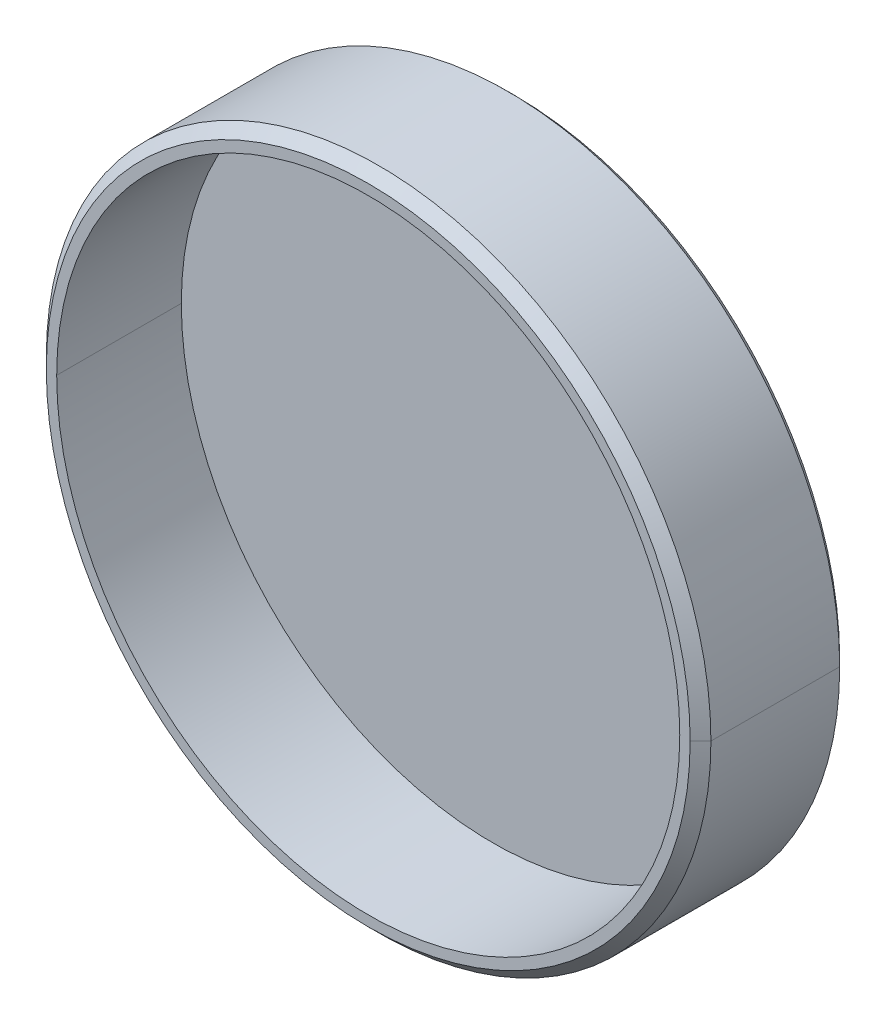
ISO-10303-21;
HEADER;
FILE_DESCRIPTION(('STEP AP214'),'2;1');
FILE_NAME('part.step','',(''),(''),'','','');
FILE_SCHEMA(('AUTOMOTIVE_DESIGN { 1 0 10303 214 1 1 1 1 }'));
ENDSEC;
DATA;
#1=APPLICATION_CONTEXT('core data for automotive mechanical design processes');
#2=APPLICATION_PROTOCOL_DEFINITION('international standard','automotive_design',2000,#1);
#3=PRODUCT_CONTEXT('',#1,'mechanical');
#4=PRODUCT('Part','Part','',(#3));
#5=PRODUCT_RELATED_PRODUCT_CATEGORY('part','',(#4));
#6=PRODUCT_DEFINITION_FORMATION('','',#4);
#7=PRODUCT_DEFINITION_CONTEXT('part definition',#1,'design');
#8=PRODUCT_DEFINITION('design','',#6,#7);
#9=PRODUCT_DEFINITION_SHAPE('','',#8);
#10=(LENGTH_UNIT() NAMED_UNIT(*) SI_UNIT(.MILLI.,.METRE.));
#11=(NAMED_UNIT(*) PLANE_ANGLE_UNIT() SI_UNIT($,.RADIAN.));
#12=(NAMED_UNIT(*) SI_UNIT($,.STERADIAN.) SOLID_ANGLE_UNIT());
#13=UNCERTAINTY_MEASURE_WITH_UNIT(LENGTH_MEASURE(1.E-05),#10,'distance_accuracy_value','');
#14=(GEOMETRIC_REPRESENTATION_CONTEXT(3) GLOBAL_UNCERTAINTY_ASSIGNED_CONTEXT((#13)) GLOBAL_UNIT_ASSIGNED_CONTEXT((#10,
#11,#12)) REPRESENTATION_CONTEXT('',''));
#15=CARTESIAN_POINT('',(0.,0.,0.));
#16=DIRECTION('',(0.,0.,1.));
#17=DIRECTION('',(1.,0.,0.));
#18=AXIS2_PLACEMENT_3D('',#15,#16,#17);
#19=CARTESIAN_POINT('',(0.,0.,0.300000000000005));
#20=DIRECTION('',(0.,0.,1.));
#21=DIRECTION('',(1.,0.,0.));
#22=AXIS2_PLACEMENT_3D('',#19,#20,#21);
#23=CONICAL_SURFACE('',#22,16.,0.785398163397454);
#24=DIRECTION('',(-0.707106781186552,0.,0.707106781186544));
#25=VECTOR('',#24,1.);
#26=CARTESIAN_POINT('',(-16.,0.,0.300000000000005));
#27=LINE('',#26,#25);
#28=CARTESIAN_POINT('',(-15.7,0.,0.));
#29=VERTEX_POINT('',#28);
#30=CARTESIAN_POINT('',(-16.,0.,0.300000000000005));
#31=VERTEX_POINT('',#30);
#32=EDGE_CURVE('E104',#29,#31,#27,.T.);
#33=ORIENTED_EDGE('',*,*,#32,.F.);
#34=CARTESIAN_POINT('',(0.,0.,0.));
#35=DIRECTION('',(0.,0.,-1.));
#36=DIRECTION('',(1.,0.,0.));
#37=AXIS2_PLACEMENT_3D('',#34,#35,#36);
#38=CIRCLE('',#37,15.7);
#39=CARTESIAN_POINT('',(15.7,0.,0.));
#40=VERTEX_POINT('',#39);
#41=EDGE_CURVE('E90',#40,#29,#38,.T.);
#42=ORIENTED_EDGE('',*,*,#41,.F.);
#43=DIRECTION('',(0.707106781186552,0.,0.707106781186544));
#44=VECTOR('',#43,1.);
#45=CARTESIAN_POINT('',(16.,0.,0.300000000000005));
#46=LINE('',#45,#44);
#47=CARTESIAN_POINT('',(16.,0.,0.300000000000005));
#48=VERTEX_POINT('',#47);
#49=EDGE_CURVE('E113',#40,#48,#46,.T.);
#50=ORIENTED_EDGE('',*,*,#49,.T.);
#51=CARTESIAN_POINT('',(0.,0.,0.300000000000005));
#52=DIRECTION('',(0.,0.,1.));
#53=DIRECTION('',(1.,0.,0.));
#54=AXIS2_PLACEMENT_3D('',#51,#52,#53);
#55=CIRCLE('',#54,16.);
#56=EDGE_CURVE('E105',#31,#48,#55,.T.);
#57=ORIENTED_EDGE('',*,*,#56,.F.);
#58=EDGE_LOOP('',(#33,#42,#50,#57));
#59=FACE_BOUND('',#58,.T.);
#60=ADVANCED_FACE('F18',(#59),#23,.T.);
#61=CARTESIAN_POINT('',(0.,0.,7.));
#62=DIRECTION('',(0.,0.,-1.));
#63=DIRECTION('',(-1.,0.,0.));
#64=AXIS2_PLACEMENT_3D('',#61,#62,#63);
#65=CONICAL_SURFACE('',#64,15.5,0.785398163397442);
#66=DIRECTION('',(0.707106781186543,0.,-0.707106781186553));
#67=VECTOR('',#66,1.);
#68=CARTESIAN_POINT('',(15.5,0.,7.));
#69=LINE('',#68,#67);
#70=CARTESIAN_POINT('',(15.5,0.,7.));
#71=VERTEX_POINT('',#70);
#72=CARTESIAN_POINT('',(16.,0.,6.5));
#73=VERTEX_POINT('',#72);
#74=EDGE_CURVE('E174',#71,#73,#69,.T.);
#75=ORIENTED_EDGE('',*,*,#74,.F.);
#76=CARTESIAN_POINT('',(0.,0.,7.));
#77=DIRECTION('',(0.,0.,1.));
#78=DIRECTION('',(1.,0.,0.));
#79=AXIS2_PLACEMENT_3D('',#76,#77,#78);
#80=CIRCLE('',#79,15.5);
#81=CARTESIAN_POINT('',(-15.5,0.,7.));
#82=VERTEX_POINT('',#81);
#83=EDGE_CURVE('E124',#82,#71,#80,.T.);
#84=ORIENTED_EDGE('',*,*,#83,.F.);
#85=DIRECTION('',(-0.707106781186543,0.,-0.707106781186553));
#86=VECTOR('',#85,1.);
#87=CARTESIAN_POINT('',(-15.5,0.,7.));
#88=LINE('',#87,#86);
#89=CARTESIAN_POINT('',(-16.,0.,6.5));
#90=VERTEX_POINT('',#89);
#91=EDGE_CURVE('E144',#82,#90,#88,.T.);
#92=ORIENTED_EDGE('',*,*,#91,.T.);
#93=CARTESIAN_POINT('',(0.,0.,6.5));
#94=DIRECTION('',(0.,0.,-1.));
#95=DIRECTION('',(1.,0.,0.));
#96=AXIS2_PLACEMENT_3D('',#93,#94,#95);
#97=CIRCLE('',#96,16.);
#98=EDGE_CURVE('E125',#73,#90,#97,.T.);
#99=ORIENTED_EDGE('',*,*,#98,.F.);
#100=EDGE_LOOP('',(#75,#84,#92,#99));
#101=FACE_BOUND('',#100,.T.);
#102=ADVANCED_FACE('F241',(#101),#65,.T.);
#103=CARTESIAN_POINT('',(0.,0.,0.1));
#104=DIRECTION('',(0.,0.,-1.));
#105=DIRECTION('',(0.,-1.,0.));
#106=AXIS2_PLACEMENT_3D('',#103,#104,#105);
#107=PLANE('',#106);
#108=CARTESIAN_POINT('',(0.,0.,0.1));
#109=DIRECTION('',(0.,0.,-1.));
#110=DIRECTION('',(-1.,0.,0.));
#111=AXIS2_PLACEMENT_3D('',#108,#109,#110);
#112=CIRCLE('',#111,13.);
#113=CARTESIAN_POINT('',(-13.,0.,0.1));
#114=VERTEX_POINT('',#113);
#115=CARTESIAN_POINT('',(13.,0.,0.1));
#116=VERTEX_POINT('',#115);
#117=EDGE_CURVE('E11',#114,#116,#112,.T.);
#118=ORIENTED_EDGE('',*,*,#117,.T.);
#119=CARTESIAN_POINT('',(0.,0.,0.1));
#120=DIRECTION('',(0.,0.,-1.));
#121=DIRECTION('',(-1.,0.,0.));
#122=AXIS2_PLACEMENT_3D('',#119,#120,#121);
#123=CIRCLE('',#122,13.);
#124=EDGE_CURVE('E194',#116,#114,#123,.T.);
#125=ORIENTED_EDGE('',*,*,#124,.T.);
#126=EDGE_LOOP('',(#118,#125));
#127=FACE_BOUND('',#126,.T.);
#128=ADVANCED_FACE('F246',(#127),#107,.T.);
#129=CARTESIAN_POINT('',(0.,0.,0.1));
#130=DIRECTION('',(0.,0.,-1.));
#131=DIRECTION('',(-1.,0.,0.));
#132=AXIS2_PLACEMENT_3D('',#129,#130,#131);
#133=CYLINDRICAL_SURFACE('',#132,13.);
#134=DIRECTION('',(0.,0.,-1.));
#135=VECTOR('',#134,1.);
#136=CARTESIAN_POINT('',(13.,0.,0.1));
#137=LINE('',#136,#135);
#138=CARTESIAN_POINT('',(13.,0.,0.));
#139=VERTEX_POINT('',#138);
#140=EDGE_CURVE('E173',#116,#139,#137,.T.);
#141=ORIENTED_EDGE('',*,*,#140,.F.);
#142=ORIENTED_EDGE('',*,*,#117,.F.);
#143=DIRECTION('',(0.,0.,-1.));
#144=VECTOR('',#143,1.);
#145=CARTESIAN_POINT('',(-13.,0.,0.1));
#146=LINE('',#145,#144);
#147=CARTESIAN_POINT('',(-13.,0.,0.));
#148=VERTEX_POINT('',#147);
#149=EDGE_CURVE('E172',#114,#148,#146,.T.);
#150=ORIENTED_EDGE('',*,*,#149,.T.);
#151=CARTESIAN_POINT('',(0.,0.,0.));
#152=DIRECTION('',(0.,0.,-1.));
#153=DIRECTION('',(-1.,0.,0.));
#154=AXIS2_PLACEMENT_3D('',#151,#152,#153);
#155=CIRCLE('',#154,13.);
#156=EDGE_CURVE('E99',#148,#139,#155,.T.);
#157=ORIENTED_EDGE('',*,*,#156,.T.);
#158=EDGE_LOOP('',(#141,#142,#150,#157));
#159=FACE_BOUND('',#158,.T.);
#160=ADVANCED_FACE('F20',(#159),#133,.F.);
#161=CARTESIAN_POINT('',(0.,0.,1.));
#162=DIRECTION('',(0.,0.,1.));
#163=DIRECTION('',(1.,0.,0.));
#164=AXIS2_PLACEMENT_3D('',#161,#162,#163);
#165=PLANE('',#164);
#166=CARTESIAN_POINT('',(0.,0.,1.));
#167=DIRECTION('',(0.,0.,1.));
#168=DIRECTION('',(1.,0.,0.));
#169=AXIS2_PLACEMENT_3D('',#166,#167,#168);
#170=CIRCLE('',#169,15.);
#171=CARTESIAN_POINT('',(-15.,0.,1.));
#172=VERTEX_POINT('',#171);
#173=CARTESIAN_POINT('',(15.,0.,1.));
#174=VERTEX_POINT('',#173);
#175=EDGE_CURVE('E22',#172,#174,#170,.T.);
#176=ORIENTED_EDGE('',*,*,#175,.T.);
#177=CARTESIAN_POINT('',(0.,0.,1.));
#178=DIRECTION('',(0.,0.,1.));
#179=DIRECTION('',(1.,0.,0.));
#180=AXIS2_PLACEMENT_3D('',#177,#178,#179);
#181=CIRCLE('',#180,15.);
#182=EDGE_CURVE('E28',#174,#172,#181,.T.);
#183=ORIENTED_EDGE('',*,*,#182,.T.);
#184=EDGE_LOOP('',(#176,#183));
#185=FACE_BOUND('',#184,.T.);
#186=ADVANCED_FACE('F236',(#185),#165,.T.);
#187=CARTESIAN_POINT('',(0.,0.,7.));
#188=DIRECTION('',(0.,0.,-1.));
#189=DIRECTION('',(-1.,0.,0.));
#190=AXIS2_PLACEMENT_3D('',#187,#188,#189);
#191=CYLINDRICAL_SURFACE('',#190,15.);
#192=DIRECTION('',(0.,0.,-1.));
#193=VECTOR('',#192,1.);
#194=CARTESIAN_POINT('',(15.,0.,7.));
#195=LINE('',#194,#193);
#196=CARTESIAN_POINT('',(15.,0.,7.));
#197=VERTEX_POINT('',#196);
#198=EDGE_CURVE('E163',#197,#174,#195,.T.);
#199=ORIENTED_EDGE('',*,*,#198,.F.);
#200=CARTESIAN_POINT('',(0.,0.,7.));
#201=DIRECTION('',(0.,0.,1.));
#202=DIRECTION('',(1.,0.,0.));
#203=AXIS2_PLACEMENT_3D('',#200,#201,#202);
#204=CIRCLE('',#203,15.);
#205=CARTESIAN_POINT('',(-15.,0.,7.));
#206=VERTEX_POINT('',#205);
#207=EDGE_CURVE('E100',#197,#206,#204,.T.);
#208=ORIENTED_EDGE('',*,*,#207,.T.);
#209=DIRECTION('',(0.,0.,-1.));
#210=VECTOR('',#209,1.);
#211=CARTESIAN_POINT('',(-15.,0.,7.));
#212=LINE('',#211,#210);
#213=EDGE_CURVE('E153',#206,#172,#212,.T.);
#214=ORIENTED_EDGE('',*,*,#213,.T.);
#215=ORIENTED_EDGE('',*,*,#182,.F.);
#216=EDGE_LOOP('',(#199,#208,#214,#215));
#217=FACE_BOUND('',#216,.T.);
#218=ADVANCED_FACE('F226',(#217),#191,.F.);
#219=CARTESIAN_POINT('',(0.,0.,0.));
#220=DIRECTION('',(0.,0.,1.));
#221=DIRECTION('',(1.,0.,0.));
#222=AXIS2_PLACEMENT_3D('',#219,#220,#221);
#223=PLANE('',#222);
#224=ORIENTED_EDGE('',*,*,#156,.F.);
#225=CARTESIAN_POINT('',(0.,0.,0.));
#226=DIRECTION('',(0.,0.,-1.));
#227=DIRECTION('',(-1.,0.,0.));
#228=AXIS2_PLACEMENT_3D('',#225,#226,#227);
#229=CIRCLE('',#228,13.);
#230=EDGE_CURVE('E168',#139,#148,#229,.T.);
#231=ORIENTED_EDGE('',*,*,#230,.F.);
#232=EDGE_LOOP('',(#224,#231));
#233=FACE_BOUND('',#232,.T.);
#234=ORIENTED_EDGE('',*,*,#41,.T.);
#235=CARTESIAN_POINT('',(0.,0.,0.));
#236=DIRECTION('',(0.,0.,-1.));
#237=DIRECTION('',(1.,0.,0.));
#238=AXIS2_PLACEMENT_3D('',#235,#236,#237);
#239=CIRCLE('',#238,15.7);
#240=EDGE_CURVE('E94',#29,#40,#239,.T.);
#241=ORIENTED_EDGE('',*,*,#240,.T.);
#242=EDGE_LOOP('',(#234,#241));
#243=FACE_BOUND('',#242,.T.);
#244=ADVANCED_FACE('F92',(#233,#243),#223,.F.);
#245=CARTESIAN_POINT('',(0.,0.,7.));
#246=DIRECTION('',(0.,0.,1.));
#247=DIRECTION('',(1.,0.,0.));
#248=AXIS2_PLACEMENT_3D('',#245,#246,#247);
#249=PLANE('',#248);
#250=CARTESIAN_POINT('',(0.,0.,7.));
#251=DIRECTION('',(0.,0.,1.));
#252=DIRECTION('',(1.,0.,0.));
#253=AXIS2_PLACEMENT_3D('',#250,#251,#252);
#254=CIRCLE('',#253,15.);
#255=EDGE_CURVE('E167',#206,#197,#254,.T.);
#256=ORIENTED_EDGE('',*,*,#255,.F.);
#257=ORIENTED_EDGE('',*,*,#207,.F.);
#258=EDGE_LOOP('',(#256,#257));
#259=FACE_BOUND('',#258,.T.);
#260=ORIENTED_EDGE('',*,*,#83,.T.);
#261=CARTESIAN_POINT('',(0.,0.,7.));
#262=DIRECTION('',(0.,0.,1.));
#263=DIRECTION('',(1.,0.,0.));
#264=AXIS2_PLACEMENT_3D('',#261,#262,#263);
#265=CIRCLE('',#264,15.5);
#266=EDGE_CURVE('E147',#71,#82,#265,.T.);
#267=ORIENTED_EDGE('',*,*,#266,.T.);
#268=EDGE_LOOP('',(#260,#267));
#269=FACE_BOUND('',#268,.T.);
#270=ADVANCED_FACE('F185',(#259,#269),#249,.T.);
#271=CARTESIAN_POINT('',(0.,0.,7.));
#272=DIRECTION('',(0.,0.,-1.));
#273=DIRECTION('',(-1.,0.,0.));
#274=AXIS2_PLACEMENT_3D('',#271,#272,#273);
#275=CYLINDRICAL_SURFACE('',#274,16.);
#276=DIRECTION('',(0.,0.,-1.));
#277=VECTOR('',#276,1.);
#278=CARTESIAN_POINT('',(16.,0.,7.));
#279=LINE('',#278,#277);
#280=EDGE_CURVE('E148',#73,#48,#279,.T.);
#281=ORIENTED_EDGE('',*,*,#280,.F.);
#282=ORIENTED_EDGE('',*,*,#98,.T.);
#283=DIRECTION('',(0.,0.,-1.));
#284=VECTOR('',#283,1.);
#285=CARTESIAN_POINT('',(-16.,0.,7.));
#286=LINE('',#285,#284);
#287=EDGE_CURVE('E152',#90,#31,#286,.T.);
#288=ORIENTED_EDGE('',*,*,#287,.T.);
#289=ORIENTED_EDGE('',*,*,#56,.T.);
#290=EDGE_LOOP('',(#281,#282,#288,#289));
#291=FACE_BOUND('',#290,.T.);
#292=ADVANCED_FACE('F233',(#291),#275,.T.);
#293=CARTESIAN_POINT('',(0.,0.,7.));
#294=DIRECTION('',(0.,0.,-1.));
#295=DIRECTION('',(-1.,0.,0.));
#296=AXIS2_PLACEMENT_3D('',#293,#294,#295);
#297=CYLINDRICAL_SURFACE('',#296,16.);
#298=CARTESIAN_POINT('',(0.,0.,6.5));
#299=DIRECTION('',(0.,0.,-1.));
#300=DIRECTION('',(1.,0.,0.));
#301=AXIS2_PLACEMENT_3D('',#298,#299,#300);
#302=CIRCLE('',#301,16.);
#303=EDGE_CURVE('E178',#90,#73,#302,.T.);
#304=ORIENTED_EDGE('',*,*,#303,.T.);
#305=ORIENTED_EDGE('',*,*,#280,.T.);
#306=CARTESIAN_POINT('',(0.,0.,0.300000000000005));
#307=DIRECTION('',(0.,0.,1.));
#308=DIRECTION('',(1.,0.,0.));
#309=AXIS2_PLACEMENT_3D('',#306,#307,#308);
#310=CIRCLE('',#309,16.);
#311=EDGE_CURVE('E110',#48,#31,#310,.T.);
#312=ORIENTED_EDGE('',*,*,#311,.T.);
#313=ORIENTED_EDGE('',*,*,#287,.F.);
#314=EDGE_LOOP('',(#304,#305,#312,#313));
#315=FACE_BOUND('',#314,.T.);
#316=ADVANCED_FACE('F252',(#315),#297,.T.);
#317=CARTESIAN_POINT('',(0.,0.,7.));
#318=DIRECTION('',(0.,0.,-1.));
#319=DIRECTION('',(-1.,0.,0.));
#320=AXIS2_PLACEMENT_3D('',#317,#318,#319);
#321=CYLINDRICAL_SURFACE('',#320,15.);
#322=ORIENTED_EDGE('',*,*,#255,.T.);
#323=ORIENTED_EDGE('',*,*,#198,.T.);
#324=ORIENTED_EDGE('',*,*,#175,.F.);
#325=ORIENTED_EDGE('',*,*,#213,.F.);
#326=EDGE_LOOP('',(#322,#323,#324,#325));
#327=FACE_BOUND('',#326,.T.);
#328=ADVANCED_FACE('F249',(#327),#321,.F.);
#329=CARTESIAN_POINT('',(0.,0.,0.1));
#330=DIRECTION('',(0.,0.,-1.));
#331=DIRECTION('',(-1.,0.,0.));
#332=AXIS2_PLACEMENT_3D('',#329,#330,#331);
#333=CYLINDRICAL_SURFACE('',#332,13.);
#334=ORIENTED_EDGE('',*,*,#124,.F.);
#335=ORIENTED_EDGE('',*,*,#140,.T.);
#336=ORIENTED_EDGE('',*,*,#230,.T.);
#337=ORIENTED_EDGE('',*,*,#149,.F.);
#338=EDGE_LOOP('',(#334,#335,#336,#337));
#339=FACE_BOUND('',#338,.T.);
#340=ADVANCED_FACE('F216',(#339),#333,.F.);
#341=CARTESIAN_POINT('',(0.,0.,7.));
#342=DIRECTION('',(0.,0.,-1.));
#343=DIRECTION('',(-1.,0.,0.));
#344=AXIS2_PLACEMENT_3D('',#341,#342,#343);
#345=CONICAL_SURFACE('',#344,15.5,0.785398163397442);
#346=ORIENTED_EDGE('',*,*,#266,.F.);
#347=ORIENTED_EDGE('',*,*,#74,.T.);
#348=ORIENTED_EDGE('',*,*,#303,.F.);
#349=ORIENTED_EDGE('',*,*,#91,.F.);
#350=EDGE_LOOP('',(#346,#347,#348,#349));
#351=FACE_BOUND('',#350,.T.);
#352=ADVANCED_FACE('F189',(#351),#345,.T.);
#353=CARTESIAN_POINT('',(0.,0.,0.300000000000005));
#354=DIRECTION('',(0.,0.,1.));
#355=DIRECTION('',(1.,0.,0.));
#356=AXIS2_PLACEMENT_3D('',#353,#354,#355);
#357=CONICAL_SURFACE('',#356,16.,0.785398163397454);
#358=ORIENTED_EDGE('',*,*,#240,.F.);
#359=ORIENTED_EDGE('',*,*,#32,.T.);
#360=ORIENTED_EDGE('',*,*,#311,.F.);
#361=ORIENTED_EDGE('',*,*,#49,.F.);
#362=EDGE_LOOP('',(#358,#359,#360,#361));
#363=FACE_BOUND('',#362,.T.);
#364=ADVANCED_FACE('F112',(#363),#357,.T.);
#365=CLOSED_SHELL('',(#60,#102,#128,#160,#186,#218,#244,#270,#292,#316,#328,#340,#352,#364));
#366=MANIFOLD_SOLID_BREP('B1',#365);
#367=ADVANCED_BREP_SHAPE_REPRESENTATION('',(#18,#366),#14);
#368=SHAPE_DEFINITION_REPRESENTATION(#9,#367);
ENDSEC;
END-ISO-10303-21;
